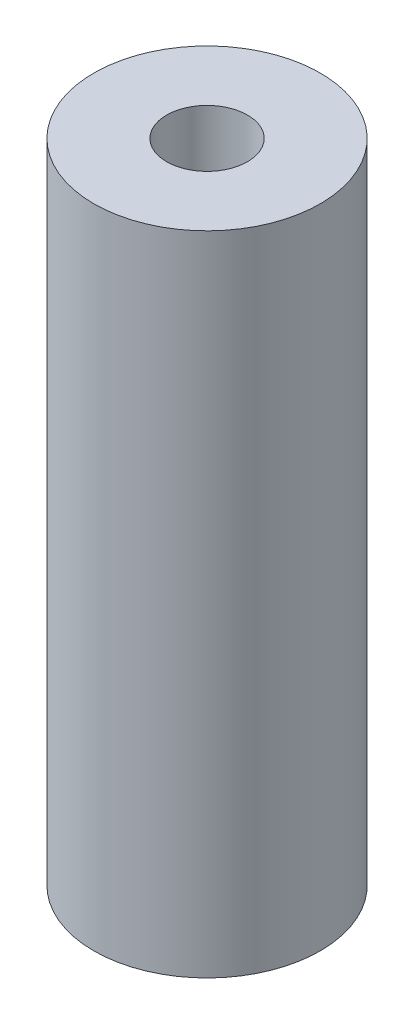
ISO-10303-21;
HEADER;
FILE_DESCRIPTION(('STEP AP214'),'2;1');
FILE_NAME('part.step','',(''),(''),'','','');
FILE_SCHEMA(('AUTOMOTIVE_DESIGN { 1 0 10303 214 1 1 1 1 }'));
ENDSEC;
DATA;
#1=APPLICATION_CONTEXT('core data for automotive mechanical design processes');
#2=APPLICATION_PROTOCOL_DEFINITION('international standard','automotive_design',2000,#1);
#3=PRODUCT_CONTEXT('',#1,'mechanical');
#4=PRODUCT('Part','Part','',(#3));
#5=PRODUCT_RELATED_PRODUCT_CATEGORY('part','',(#4));
#6=PRODUCT_DEFINITION_FORMATION('','',#4);
#7=PRODUCT_DEFINITION_CONTEXT('part definition',#1,'design');
#8=PRODUCT_DEFINITION('design','',#6,#7);
#9=PRODUCT_DEFINITION_SHAPE('','',#8);
#10=(LENGTH_UNIT() NAMED_UNIT(*) SI_UNIT(.MILLI.,.METRE.));
#11=(NAMED_UNIT(*) PLANE_ANGLE_UNIT() SI_UNIT($,.RADIAN.));
#12=(NAMED_UNIT(*) SI_UNIT($,.STERADIAN.) SOLID_ANGLE_UNIT());
#13=UNCERTAINTY_MEASURE_WITH_UNIT(LENGTH_MEASURE(1.E-05),#10,'distance_accuracy_value','');
#14=(GEOMETRIC_REPRESENTATION_CONTEXT(3) GLOBAL_UNCERTAINTY_ASSIGNED_CONTEXT((#13)) GLOBAL_UNIT_ASSIGNED_CONTEXT((#10,
#11,#12)) REPRESENTATION_CONTEXT('',''));
#15=CARTESIAN_POINT('',(0.,0.,0.));
#16=DIRECTION('',(0.,0.,1.));
#17=DIRECTION('',(1.,0.,0.));
#18=AXIS2_PLACEMENT_3D('',#15,#16,#17);
#19=CARTESIAN_POINT('',(0.,40.,0.));
#20=DIRECTION('',(0.,1.,0.));
#21=DIRECTION('',(0.,0.,1.));
#22=AXIS2_PLACEMENT_3D('',#19,#20,#21);
#23=PLANE('',#22);
#24=CARTESIAN_POINT('',(0.,40.,0.));
#25=DIRECTION('',(0.,1.,0.));
#26=DIRECTION('',(0.,0.,1.));
#27=AXIS2_PLACEMENT_3D('',#24,#25,#26);
#28=CIRCLE('',#27,7.);
#29=CARTESIAN_POINT('',(0.,40.,7.));
#30=VERTEX_POINT('',#29);
#31=EDGE_CURVE('E10',#30,#30,#28,.T.);
#32=ORIENTED_EDGE('',*,*,#31,.T.);
#33=EDGE_LOOP('',(#32));
#34=FACE_BOUND('',#33,.T.);
#35=CARTESIAN_POINT('',(0.,40.,0.));
#36=DIRECTION('',(0.,1.,0.));
#37=DIRECTION('',(0.,0.,1.));
#38=AXIS2_PLACEMENT_3D('',#35,#36,#37);
#39=CIRCLE('',#38,2.5);
#40=CARTESIAN_POINT('',(0.,40.,2.5));
#41=VERTEX_POINT('',#40);
#42=EDGE_CURVE('E40',#41,#41,#39,.T.);
#43=ORIENTED_EDGE('',*,*,#42,.F.);
#44=EDGE_LOOP('',(#43));
#45=FACE_BOUND('',#44,.T.);
#46=ADVANCED_FACE('F29',(#34,#45),#23,.T.);
#47=CARTESIAN_POINT('',(0.,0.,0.));
#48=DIRECTION('',(0.,1.,0.));
#49=DIRECTION('',(0.,0.,1.));
#50=AXIS2_PLACEMENT_3D('',#47,#48,#49);
#51=PLANE('',#50);
#52=CARTESIAN_POINT('',(0.,0.,0.));
#53=DIRECTION('',(0.,1.,0.));
#54=DIRECTION('',(0.,0.,1.));
#55=AXIS2_PLACEMENT_3D('',#52,#53,#54);
#56=CIRCLE('',#55,7.);
#57=CARTESIAN_POINT('',(0.,0.,7.));
#58=VERTEX_POINT('',#57);
#59=EDGE_CURVE('E33',#58,#58,#56,.T.);
#60=ORIENTED_EDGE('',*,*,#59,.F.);
#61=EDGE_LOOP('',(#60));
#62=FACE_BOUND('',#61,.T.);
#63=CARTESIAN_POINT('',(0.,0.,0.));
#64=DIRECTION('',(0.,1.,0.));
#65=DIRECTION('',(0.,0.,1.));
#66=AXIS2_PLACEMENT_3D('',#63,#64,#65);
#67=CIRCLE('',#66,2.5);
#68=CARTESIAN_POINT('',(0.,0.,2.5));
#69=VERTEX_POINT('',#68);
#70=EDGE_CURVE('E42',#69,#69,#67,.T.);
#71=ORIENTED_EDGE('',*,*,#70,.T.);
#72=EDGE_LOOP('',(#71));
#73=FACE_BOUND('',#72,.T.);
#74=ADVANCED_FACE('F52',(#62,#73),#51,.F.);
#75=CARTESIAN_POINT('',(0.,40.,0.));
#76=DIRECTION('',(0.,-1.,0.));
#77=DIRECTION('',(0.,0.,-1.));
#78=AXIS2_PLACEMENT_3D('',#75,#76,#77);
#79=CYLINDRICAL_SURFACE('',#78,7.);
#80=ORIENTED_EDGE('',*,*,#31,.F.);
#81=EDGE_LOOP('',(#80));
#82=FACE_BOUND('',#81,.T.);
#83=ORIENTED_EDGE('',*,*,#59,.T.);
#84=EDGE_LOOP('',(#83));
#85=FACE_BOUND('',#84,.T.);
#86=ADVANCED_FACE('F31',(#82,#85),#79,.T.);
#87=CARTESIAN_POINT('',(0.,40.,0.));
#88=DIRECTION('',(0.,-1.,0.));
#89=DIRECTION('',(0.,0.,-1.));
#90=AXIS2_PLACEMENT_3D('',#87,#88,#89);
#91=CYLINDRICAL_SURFACE('',#90,2.5);
#92=ORIENTED_EDGE('',*,*,#42,.T.);
#93=EDGE_LOOP('',(#92));
#94=FACE_BOUND('',#93,.T.);
#95=ORIENTED_EDGE('',*,*,#70,.F.);
#96=EDGE_LOOP('',(#95));
#97=FACE_BOUND('',#96,.T.);
#98=ADVANCED_FACE('F48',(#94,#97),#91,.F.);
#99=CLOSED_SHELL('',(#46,#74,#86,#98));
#100=MANIFOLD_SOLID_BREP('B2',#99);
#101=ADVANCED_BREP_SHAPE_REPRESENTATION('',(#18,#100),#14);
#102=SHAPE_DEFINITION_REPRESENTATION(#9,#101);
ENDSEC;
END-ISO-10303-21;
